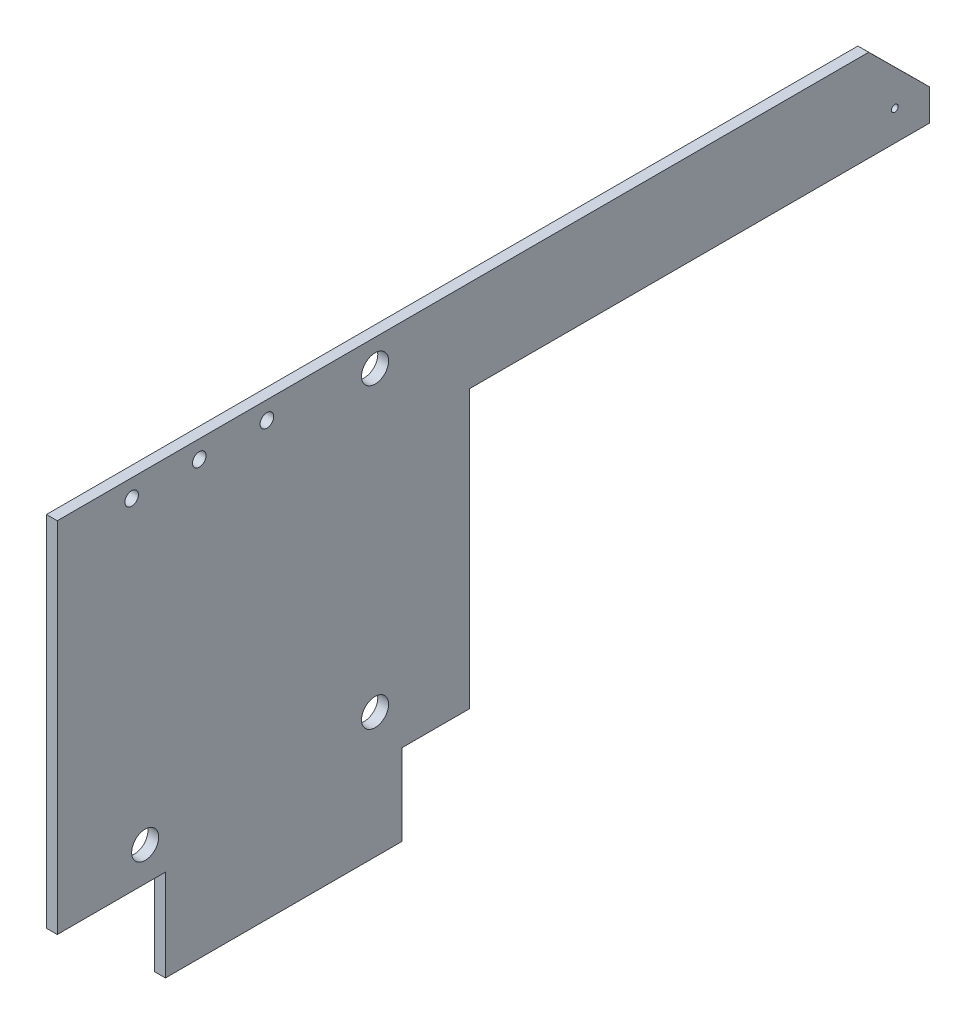
ISO-10303-21;
HEADER;
FILE_DESCRIPTION(('STEP AP214'),'2;1');
FILE_NAME('part.step','',(''),(''),'','','');
FILE_SCHEMA(('AUTOMOTIVE_DESIGN { 1 0 10303 214 1 1 1 1 }'));
ENDSEC;
DATA;
#1=APPLICATION_CONTEXT('core data for automotive mechanical design processes');
#2=APPLICATION_PROTOCOL_DEFINITION('international standard','automotive_design',2000,#1);
#3=PRODUCT_CONTEXT('',#1,'mechanical');
#4=PRODUCT('Part','Part','',(#3));
#5=PRODUCT_RELATED_PRODUCT_CATEGORY('part','',(#4));
#6=PRODUCT_DEFINITION_FORMATION('','',#4);
#7=PRODUCT_DEFINITION_CONTEXT('part definition',#1,'design');
#8=PRODUCT_DEFINITION('design','',#6,#7);
#9=PRODUCT_DEFINITION_SHAPE('','',#8);
#10=(LENGTH_UNIT() NAMED_UNIT(*) SI_UNIT(.MILLI.,.METRE.));
#11=(NAMED_UNIT(*) PLANE_ANGLE_UNIT() SI_UNIT($,.RADIAN.));
#12=(NAMED_UNIT(*) SI_UNIT($,.STERADIAN.) SOLID_ANGLE_UNIT());
#13=UNCERTAINTY_MEASURE_WITH_UNIT(LENGTH_MEASURE(1.E-05),#10,'distance_accuracy_value','');
#14=(GEOMETRIC_REPRESENTATION_CONTEXT(3) GLOBAL_UNCERTAINTY_ASSIGNED_CONTEXT((#13)) GLOBAL_UNIT_ASSIGNED_CONTEXT((#10,
#11,#12)) REPRESENTATION_CONTEXT('',''));
#15=CARTESIAN_POINT('',(0.,0.,0.));
#16=DIRECTION('',(0.,0.,1.));
#17=DIRECTION('',(1.,0.,0.));
#18=AXIS2_PLACEMENT_3D('',#15,#16,#17);
#19=CARTESIAN_POINT('',(1.6,0.,0.));
#20=DIRECTION('',(-1.,0.,0.));
#21=DIRECTION('',(0.,0.,1.));
#22=AXIS2_PLACEMENT_3D('',#19,#20,#21);
#23=PLANE('',#22);
#24=DIRECTION('',(0.,0.,-1.));
#25=VECTOR('',#24,1.);
#26=CARTESIAN_POINT('',(1.6,0.,-16.));
#27=LINE('',#26,#25);
#28=CARTESIAN_POINT('',(1.6,0.,0.));
#29=VERTEX_POINT('',#28);
#30=CARTESIAN_POINT('',(1.6,0.,-16.));
#31=VERTEX_POINT('',#30);
#32=EDGE_CURVE('E191',#29,#31,#27,.T.);
#33=ORIENTED_EDGE('',*,*,#32,.T.);
#34=DIRECTION('',(0.,-1.,0.));
#35=VECTOR('',#34,1.);
#36=CARTESIAN_POINT('',(1.6,-13.5639260212554,-16.));
#37=LINE('',#36,#35);
#38=CARTESIAN_POINT('',(1.6,-13.5639260212554,-16.));
#39=VERTEX_POINT('',#38);
#40=EDGE_CURVE('E109',#31,#39,#37,.T.);
#41=ORIENTED_EDGE('',*,*,#40,.T.);
#42=DIRECTION('',(0.,0.,-1.));
#43=VECTOR('',#42,1.);
#44=CARTESIAN_POINT('',(1.6,-13.5639260212554,-51.));
#45=LINE('',#44,#43);
#46=CARTESIAN_POINT('',(1.6,-13.5639260212554,-51.));
#47=VERTEX_POINT('',#46);
#48=EDGE_CURVE('E224',#39,#47,#45,.T.);
#49=ORIENTED_EDGE('',*,*,#48,.T.);
#50=DIRECTION('',(0.,1.,0.));
#51=VECTOR('',#50,1.);
#52=CARTESIAN_POINT('',(1.6,-1.56392602125544,-51.));
#53=LINE('',#52,#51);
#54=CARTESIAN_POINT('',(1.6,-1.56392602125544,-51.));
#55=VERTEX_POINT('',#54);
#56=EDGE_CURVE('E244',#47,#55,#53,.T.);
#57=ORIENTED_EDGE('',*,*,#56,.T.);
#58=DIRECTION('',(0.,0.,-1.));
#59=VECTOR('',#58,1.);
#60=CARTESIAN_POINT('',(1.6,-1.56392602125544,-61.));
#61=LINE('',#60,#59);
#62=CARTESIAN_POINT('',(1.6,-1.56392602125544,-61.));
#63=VERTEX_POINT('',#62);
#64=EDGE_CURVE('E240',#55,#63,#61,.T.);
#65=ORIENTED_EDGE('',*,*,#64,.T.);
#66=DIRECTION('',(0.,1.,0.));
#67=VECTOR('',#66,1.);
#68=CARTESIAN_POINT('',(1.6,39.4234303047777,-61.));
#69=LINE('',#68,#67);
#70=CARTESIAN_POINT('',(1.6,39.4234303047777,-61.));
#71=VERTEX_POINT('',#70);
#72=EDGE_CURVE('E243',#63,#71,#69,.T.);
#73=ORIENTED_EDGE('',*,*,#72,.T.);
#74=DIRECTION('',(0.,0.,-1.));
#75=VECTOR('',#74,1.);
#76=CARTESIAN_POINT('',(1.6,39.4234303047777,-129.));
#77=LINE('',#76,#75);
#78=CARTESIAN_POINT('',(1.6,39.4234303047777,-129.));
#79=VERTEX_POINT('',#78);
#80=EDGE_CURVE('E248',#71,#79,#77,.T.);
#81=ORIENTED_EDGE('',*,*,#80,.T.);
#82=DIRECTION('',(0.,1.,0.));
#83=VECTOR('',#82,1.);
#84=CARTESIAN_POINT('',(1.6,44.0634303047776,-129.));
#85=LINE('',#84,#83);
#86=CARTESIAN_POINT('',(1.6,44.0634303047776,-129.));
#87=VERTEX_POINT('',#86);
#88=EDGE_CURVE('E137',#79,#87,#85,.T.);
#89=ORIENTED_EDGE('',*,*,#88,.T.);
#90=DIRECTION('',(0.,0.704601785817616,0.709602933634456));
#91=VECTOR('',#90,1.);
#92=CARTESIAN_POINT('',(1.6,53.,-120.));
#93=LINE('',#92,#91);
#94=CARTESIAN_POINT('',(1.6,53.,-120.));
#95=VERTEX_POINT('',#94);
#96=EDGE_CURVE('E131',#87,#95,#93,.T.);
#97=ORIENTED_EDGE('',*,*,#96,.T.);
#98=DIRECTION('',(0.,0.,1.));
#99=VECTOR('',#98,1.);
#100=CARTESIAN_POINT('',(1.6,53.,0.));
#101=LINE('',#100,#99);
#102=CARTESIAN_POINT('',(1.6,53.,0.));
#103=VERTEX_POINT('',#102);
#104=EDGE_CURVE('E135',#95,#103,#101,.T.);
#105=ORIENTED_EDGE('',*,*,#104,.T.);
#106=DIRECTION('',(0.,-1.,0.));
#107=VECTOR('',#106,1.);
#108=CARTESIAN_POINT('',(1.6,0.,0.));
#109=LINE('',#108,#107);
#110=EDGE_CURVE('E57',#103,#29,#109,.T.);
#111=ORIENTED_EDGE('',*,*,#110,.T.);
#112=EDGE_LOOP('',(#33,#41,#49,#57,#65,#73,#81,#89,#97,#105,#111));
#113=FACE_BOUND('',#112,.T.);
#114=CARTESIAN_POINT('',(1.6,5.,-13.));
#115=DIRECTION('',(1.,0.,0.));
#116=DIRECTION('',(0.,0.,-1.));
#117=AXIS2_PLACEMENT_3D('',#114,#115,#116);
#118=CIRCLE('',#117,2.);
#119=CARTESIAN_POINT('',(1.6,5.,-15.));
#120=VERTEX_POINT('',#119);
#121=EDGE_CURVE('E164',#120,#120,#118,.T.);
#122=ORIENTED_EDGE('',*,*,#121,.F.);
#123=EDGE_LOOP('',(#122));
#124=FACE_BOUND('',#123,.T.);
#125=CARTESIAN_POINT('',(1.6,5.,-47.));
#126=DIRECTION('',(1.,0.,0.));
#127=DIRECTION('',(0.,0.,-1.));
#128=AXIS2_PLACEMENT_3D('',#125,#126,#127);
#129=CIRCLE('',#128,2.);
#130=CARTESIAN_POINT('',(1.6,5.,-49.));
#131=VERTEX_POINT('',#130);
#132=EDGE_CURVE('E357',#131,#131,#129,.T.);
#133=ORIENTED_EDGE('',*,*,#132,.F.);
#134=EDGE_LOOP('',(#133));
#135=FACE_BOUND('',#134,.T.);
#136=CARTESIAN_POINT('',(1.6,49.,-47.));
#137=DIRECTION('',(1.,0.,0.));
#138=DIRECTION('',(0.,0.,-1.));
#139=AXIS2_PLACEMENT_3D('',#136,#137,#138);
#140=CIRCLE('',#139,2.);
#141=CARTESIAN_POINT('',(1.6,49.,-49.));
#142=VERTEX_POINT('',#141);
#143=EDGE_CURVE('E349',#142,#142,#140,.T.);
#144=ORIENTED_EDGE('',*,*,#143,.F.);
#145=EDGE_LOOP('',(#144));
#146=FACE_BOUND('',#145,.T.);
#147=CARTESIAN_POINT('',(1.6,50.35,-21.));
#148=DIRECTION('',(1.,0.,0.));
#149=DIRECTION('',(0.,0.,-1.));
#150=AXIS2_PLACEMENT_3D('',#147,#148,#149);
#151=CIRCLE('',#150,1.00000000000001);
#152=CARTESIAN_POINT('',(1.6,50.35,-22.));
#153=VERTEX_POINT('',#152);
#154=EDGE_CURVE('E341',#153,#153,#151,.T.);
#155=ORIENTED_EDGE('',*,*,#154,.F.);
#156=EDGE_LOOP('',(#155));
#157=FACE_BOUND('',#156,.T.);
#158=CARTESIAN_POINT('',(1.6,50.35,-31.));
#159=DIRECTION('',(1.,0.,0.));
#160=DIRECTION('',(0.,0.,-1.));
#161=AXIS2_PLACEMENT_3D('',#158,#159,#160);
#162=CIRCLE('',#161,0.999999999999998);
#163=CARTESIAN_POINT('',(1.6,50.35,-32.));
#164=VERTEX_POINT('',#163);
#165=EDGE_CURVE('E333',#164,#164,#162,.T.);
#166=ORIENTED_EDGE('',*,*,#165,.F.);
#167=EDGE_LOOP('',(#166));
#168=FACE_BOUND('',#167,.T.);
#169=CARTESIAN_POINT('',(1.6,50.35,-11.));
#170=DIRECTION('',(1.,0.,0.));
#171=DIRECTION('',(0.,0.,-1.));
#172=AXIS2_PLACEMENT_3D('',#169,#170,#171);
#173=CIRCLE('',#172,1.00000000000001);
#174=CARTESIAN_POINT('',(1.6,50.35,-12.));
#175=VERTEX_POINT('',#174);
#176=EDGE_CURVE('E325',#175,#175,#173,.T.);
#177=ORIENTED_EDGE('',*,*,#176,.F.);
#178=EDGE_LOOP('',(#177));
#179=FACE_BOUND('',#178,.T.);
#180=CARTESIAN_POINT('',(1.6,43.8829008644053,-123.861808855805));
#181=DIRECTION('',(1.,0.,0.));
#182=DIRECTION('',(0.,0.,-1.));
#183=AXIS2_PLACEMENT_3D('',#180,#181,#182);
#184=CIRCLE('',#183,0.499999999999999);
#185=CARTESIAN_POINT('',(1.6,43.8829008644053,-124.361808855805));
#186=VERTEX_POINT('',#185);
#187=EDGE_CURVE('E314',#186,#186,#184,.T.);
#188=ORIENTED_EDGE('',*,*,#187,.F.);
#189=EDGE_LOOP('',(#188));
#190=FACE_BOUND('',#189,.T.);
#191=ADVANCED_FACE('F39',(#113,#124,#135,#146,#157,#168,#179,#190),#23,.F.);
#192=CARTESIAN_POINT('',(0.,0.,0.));
#193=DIRECTION('',(-1.,0.,0.));
#194=DIRECTION('',(0.,0.,1.));
#195=AXIS2_PLACEMENT_3D('',#192,#193,#194);
#196=PLANE('',#195);
#197=CARTESIAN_POINT('',(0.,50.35,-11.));
#198=DIRECTION('',(1.,0.,0.));
#199=DIRECTION('',(0.,0.,-1.));
#200=AXIS2_PLACEMENT_3D('',#197,#198,#199);
#201=CIRCLE('',#200,1.00000000000001);
#202=CARTESIAN_POINT('',(0.,50.35,-12.));
#203=VERTEX_POINT('',#202);
#204=EDGE_CURVE('E322',#203,#203,#201,.T.);
#205=ORIENTED_EDGE('',*,*,#204,.T.);
#206=EDGE_LOOP('',(#205));
#207=FACE_BOUND('',#206,.T.);
#208=CARTESIAN_POINT('',(0.,50.35,-21.));
#209=DIRECTION('',(1.,0.,0.));
#210=DIRECTION('',(0.,0.,-1.));
#211=AXIS2_PLACEMENT_3D('',#208,#209,#210);
#212=CIRCLE('',#211,1.00000000000001);
#213=CARTESIAN_POINT('',(0.,50.35,-22.));
#214=VERTEX_POINT('',#213);
#215=EDGE_CURVE('E337',#214,#214,#212,.T.);
#216=ORIENTED_EDGE('',*,*,#215,.T.);
#217=EDGE_LOOP('',(#216));
#218=FACE_BOUND('',#217,.T.);
#219=CARTESIAN_POINT('',(0.,5.,-47.));
#220=DIRECTION('',(1.,0.,0.));
#221=DIRECTION('',(0.,0.,-1.));
#222=AXIS2_PLACEMENT_3D('',#219,#220,#221);
#223=CIRCLE('',#222,2.);
#224=CARTESIAN_POINT('',(0.,5.,-49.));
#225=VERTEX_POINT('',#224);
#226=EDGE_CURVE('E353',#225,#225,#223,.T.);
#227=ORIENTED_EDGE('',*,*,#226,.T.);
#228=EDGE_LOOP('',(#227));
#229=FACE_BOUND('',#228,.T.);
#230=DIRECTION('',(0.,0.,-1.));
#231=VECTOR('',#230,1.);
#232=CARTESIAN_POINT('',(0.,0.,-16.));
#233=LINE('',#232,#231);
#234=CARTESIAN_POINT('',(0.,0.,0.));
#235=VERTEX_POINT('',#234);
#236=CARTESIAN_POINT('',(0.,0.,-16.));
#237=VERTEX_POINT('',#236);
#238=EDGE_CURVE('E159',#235,#237,#233,.T.);
#239=ORIENTED_EDGE('',*,*,#238,.F.);
#240=DIRECTION('',(0.,-1.,0.));
#241=VECTOR('',#240,1.);
#242=CARTESIAN_POINT('',(0.,0.,0.));
#243=LINE('',#242,#241);
#244=CARTESIAN_POINT('',(0.,53.,0.));
#245=VERTEX_POINT('',#244);
#246=EDGE_CURVE('E101',#245,#235,#243,.T.);
#247=ORIENTED_EDGE('',*,*,#246,.F.);
#248=DIRECTION('',(0.,0.,1.));
#249=VECTOR('',#248,1.);
#250=CARTESIAN_POINT('',(0.,53.,0.));
#251=LINE('',#250,#249);
#252=CARTESIAN_POINT('',(0.,53.,-120.));
#253=VERTEX_POINT('',#252);
#254=EDGE_CURVE('E95',#253,#245,#251,.T.);
#255=ORIENTED_EDGE('',*,*,#254,.F.);
#256=DIRECTION('',(0.,0.704601785817616,0.709602933634456));
#257=VECTOR('',#256,1.);
#258=CARTESIAN_POINT('',(0.,53.,-120.));
#259=LINE('',#258,#257);
#260=CARTESIAN_POINT('',(0.,44.0634303047776,-129.));
#261=VERTEX_POINT('',#260);
#262=EDGE_CURVE('E146',#261,#253,#259,.T.);
#263=ORIENTED_EDGE('',*,*,#262,.F.);
#264=DIRECTION('',(0.,1.,0.));
#265=VECTOR('',#264,1.);
#266=CARTESIAN_POINT('',(0.,44.0634303047776,-129.));
#267=LINE('',#266,#265);
#268=CARTESIAN_POINT('',(0.,39.4234303047777,-129.));
#269=VERTEX_POINT('',#268);
#270=EDGE_CURVE('E182',#269,#261,#267,.T.);
#271=ORIENTED_EDGE('',*,*,#270,.F.);
#272=DIRECTION('',(0.,0.,-1.));
#273=VECTOR('',#272,1.);
#274=CARTESIAN_POINT('',(0.,39.4234303047777,-129.));
#275=LINE('',#274,#273);
#276=CARTESIAN_POINT('',(0.,39.4234303047777,-61.));
#277=VERTEX_POINT('',#276);
#278=EDGE_CURVE('E179',#277,#269,#275,.T.);
#279=ORIENTED_EDGE('',*,*,#278,.F.);
#280=DIRECTION('',(0.,1.,0.));
#281=VECTOR('',#280,1.);
#282=CARTESIAN_POINT('',(0.,39.4234303047777,-61.));
#283=LINE('',#282,#281);
#284=CARTESIAN_POINT('',(0.,-1.56392602125544,-61.));
#285=VERTEX_POINT('',#284);
#286=EDGE_CURVE('E176',#285,#277,#283,.T.);
#287=ORIENTED_EDGE('',*,*,#286,.F.);
#288=DIRECTION('',(0.,0.,-1.));
#289=VECTOR('',#288,1.);
#290=CARTESIAN_POINT('',(0.,-1.56392602125544,-61.));
#291=LINE('',#290,#289);
#292=CARTESIAN_POINT('',(0.,-1.56392602125544,-51.));
#293=VERTEX_POINT('',#292);
#294=EDGE_CURVE('E173',#293,#285,#291,.T.);
#295=ORIENTED_EDGE('',*,*,#294,.F.);
#296=DIRECTION('',(0.,1.,0.));
#297=VECTOR('',#296,1.);
#298=CARTESIAN_POINT('',(0.,-1.56392602125544,-51.));
#299=LINE('',#298,#297);
#300=CARTESIAN_POINT('',(0.,-13.5639260212554,-51.));
#301=VERTEX_POINT('',#300);
#302=EDGE_CURVE('E170',#301,#293,#299,.T.);
#303=ORIENTED_EDGE('',*,*,#302,.F.);
#304=DIRECTION('',(0.,0.,-1.));
#305=VECTOR('',#304,1.);
#306=CARTESIAN_POINT('',(0.,-13.5639260212554,-51.));
#307=LINE('',#306,#305);
#308=CARTESIAN_POINT('',(0.,-13.5639260212554,-16.));
#309=VERTEX_POINT('',#308);
#310=EDGE_CURVE('E167',#309,#301,#307,.T.);
#311=ORIENTED_EDGE('',*,*,#310,.F.);
#312=DIRECTION('',(0.,-1.,0.));
#313=VECTOR('',#312,1.);
#314=CARTESIAN_POINT('',(0.,-13.5639260212554,-16.));
#315=LINE('',#314,#313);
#316=EDGE_CURVE('E163',#237,#309,#315,.T.);
#317=ORIENTED_EDGE('',*,*,#316,.F.);
#318=EDGE_LOOP('',(#239,#247,#255,#263,#271,#279,#287,#295,#303,#311,#317));
#319=FACE_BOUND('',#318,.T.);
#320=CARTESIAN_POINT('',(0.,5.,-13.));
#321=DIRECTION('',(1.,0.,0.));
#322=DIRECTION('',(0.,0.,-1.));
#323=AXIS2_PLACEMENT_3D('',#320,#321,#322);
#324=CIRCLE('',#323,2.);
#325=CARTESIAN_POINT('',(0.,5.,-15.));
#326=VERTEX_POINT('',#325);
#327=EDGE_CURVE('E361',#326,#326,#324,.T.);
#328=ORIENTED_EDGE('',*,*,#327,.T.);
#329=EDGE_LOOP('',(#328));
#330=FACE_BOUND('',#329,.T.);
#331=CARTESIAN_POINT('',(0.,49.,-47.));
#332=DIRECTION('',(1.,0.,0.));
#333=DIRECTION('',(0.,0.,-1.));
#334=AXIS2_PLACEMENT_3D('',#331,#332,#333);
#335=CIRCLE('',#334,2.);
#336=CARTESIAN_POINT('',(0.,49.,-49.));
#337=VERTEX_POINT('',#336);
#338=EDGE_CURVE('E345',#337,#337,#335,.T.);
#339=ORIENTED_EDGE('',*,*,#338,.T.);
#340=EDGE_LOOP('',(#339));
#341=FACE_BOUND('',#340,.T.);
#342=CARTESIAN_POINT('',(0.,50.35,-31.));
#343=DIRECTION('',(1.,0.,0.));
#344=DIRECTION('',(0.,0.,-1.));
#345=AXIS2_PLACEMENT_3D('',#342,#343,#344);
#346=CIRCLE('',#345,0.999999999999998);
#347=CARTESIAN_POINT('',(0.,50.35,-32.));
#348=VERTEX_POINT('',#347);
#349=EDGE_CURVE('E329',#348,#348,#346,.T.);
#350=ORIENTED_EDGE('',*,*,#349,.T.);
#351=EDGE_LOOP('',(#350));
#352=FACE_BOUND('',#351,.T.);
#353=CARTESIAN_POINT('',(0.,43.8829008644053,-123.861808855805));
#354=DIRECTION('',(1.,0.,0.));
#355=DIRECTION('',(0.,0.,-1.));
#356=AXIS2_PLACEMENT_3D('',#353,#354,#355);
#357=CIRCLE('',#356,0.499999999999999);
#358=CARTESIAN_POINT('',(0.,43.8829008644053,-124.361808855805));
#359=VERTEX_POINT('',#358);
#360=EDGE_CURVE('E317',#359,#359,#357,.T.);
#361=ORIENTED_EDGE('',*,*,#360,.T.);
#362=EDGE_LOOP('',(#361));
#363=FACE_BOUND('',#362,.T.);
#364=ADVANCED_FACE('F228',(#207,#218,#229,#319,#330,#341,#352,#363),#196,.T.);
#365=CARTESIAN_POINT('',(1.6,0.,-16.));
#366=DIRECTION('',(0.,1.,0.));
#367=DIRECTION('',(0.,0.,1.));
#368=AXIS2_PLACEMENT_3D('',#365,#366,#367);
#369=PLANE('',#368);
#370=ORIENTED_EDGE('',*,*,#238,.T.);
#371=DIRECTION('',(-1.,0.,0.));
#372=VECTOR('',#371,1.);
#373=CARTESIAN_POINT('',(1.6,0.,-16.));
#374=LINE('',#373,#372);
#375=EDGE_CURVE('E11',#31,#237,#374,.T.);
#376=ORIENTED_EDGE('',*,*,#375,.F.);
#377=ORIENTED_EDGE('',*,*,#32,.F.);
#378=DIRECTION('',(-1.,0.,0.));
#379=VECTOR('',#378,1.);
#380=CARTESIAN_POINT('',(1.6,0.,0.));
#381=LINE('',#380,#379);
#382=EDGE_CURVE('E155',#29,#235,#381,.T.);
#383=ORIENTED_EDGE('',*,*,#382,.T.);
#384=EDGE_LOOP('',(#370,#376,#377,#383));
#385=FACE_BOUND('',#384,.T.);
#386=ADVANCED_FACE('F41',(#385),#369,.F.);
#387=CARTESIAN_POINT('',(1.6,-13.5639260212554,-16.));
#388=DIRECTION('',(0.,0.,-1.));
#389=DIRECTION('',(-1.,0.,0.));
#390=AXIS2_PLACEMENT_3D('',#387,#388,#389);
#391=PLANE('',#390);
#392=ORIENTED_EDGE('',*,*,#316,.T.);
#393=DIRECTION('',(-1.,0.,0.));
#394=VECTOR('',#393,1.);
#395=CARTESIAN_POINT('',(1.6,-13.5639260212554,-16.));
#396=LINE('',#395,#394);
#397=EDGE_CURVE('E49',#39,#309,#396,.T.);
#398=ORIENTED_EDGE('',*,*,#397,.F.);
#399=ORIENTED_EDGE('',*,*,#40,.F.);
#400=ORIENTED_EDGE('',*,*,#375,.T.);
#401=EDGE_LOOP('',(#392,#398,#399,#400));
#402=FACE_BOUND('',#401,.T.);
#403=ADVANCED_FACE('F496',(#402),#391,.F.);
#404=CARTESIAN_POINT('',(1.6,-13.5639260212554,-51.));
#405=DIRECTION('',(0.,1.,0.));
#406=DIRECTION('',(0.,0.,1.));
#407=AXIS2_PLACEMENT_3D('',#404,#405,#406);
#408=PLANE('',#407);
#409=ORIENTED_EDGE('',*,*,#310,.T.);
#410=DIRECTION('',(-1.,0.,0.));
#411=VECTOR('',#410,1.);
#412=CARTESIAN_POINT('',(1.6,-13.5639260212554,-51.));
#413=LINE('',#412,#411);
#414=EDGE_CURVE('E214',#47,#301,#413,.T.);
#415=ORIENTED_EDGE('',*,*,#414,.F.);
#416=ORIENTED_EDGE('',*,*,#48,.F.);
#417=ORIENTED_EDGE('',*,*,#397,.T.);
#418=EDGE_LOOP('',(#409,#415,#416,#417));
#419=FACE_BOUND('',#418,.T.);
#420=ADVANCED_FACE('F222',(#419),#408,.F.);
#421=CARTESIAN_POINT('',(1.6,-1.56392602125544,-51.));
#422=DIRECTION('',(0.,0.,1.));
#423=DIRECTION('',(1.,0.,0.));
#424=AXIS2_PLACEMENT_3D('',#421,#422,#423);
#425=PLANE('',#424);
#426=ORIENTED_EDGE('',*,*,#302,.T.);
#427=DIRECTION('',(-1.,0.,0.));
#428=VECTOR('',#427,1.);
#429=CARTESIAN_POINT('',(1.6,-1.56392602125544,-51.));
#430=LINE('',#429,#428);
#431=EDGE_CURVE('E210',#55,#293,#430,.T.);
#432=ORIENTED_EDGE('',*,*,#431,.F.);
#433=ORIENTED_EDGE('',*,*,#56,.F.);
#434=ORIENTED_EDGE('',*,*,#414,.T.);
#435=EDGE_LOOP('',(#426,#432,#433,#434));
#436=FACE_BOUND('',#435,.T.);
#437=ADVANCED_FACE('F234',(#436),#425,.F.);
#438=CARTESIAN_POINT('',(1.6,-1.56392602125544,-61.));
#439=DIRECTION('',(0.,1.,0.));
#440=DIRECTION('',(0.,0.,1.));
#441=AXIS2_PLACEMENT_3D('',#438,#439,#440);
#442=PLANE('',#441);
#443=ORIENTED_EDGE('',*,*,#294,.T.);
#444=DIRECTION('',(-1.,0.,0.));
#445=VECTOR('',#444,1.);
#446=CARTESIAN_POINT('',(1.6,-1.56392602125544,-61.));
#447=LINE('',#446,#445);
#448=EDGE_CURVE('E206',#63,#285,#447,.T.);
#449=ORIENTED_EDGE('',*,*,#448,.F.);
#450=ORIENTED_EDGE('',*,*,#64,.F.);
#451=ORIENTED_EDGE('',*,*,#431,.T.);
#452=EDGE_LOOP('',(#443,#449,#450,#451));
#453=FACE_BOUND('',#452,.T.);
#454=ADVANCED_FACE('F238',(#453),#442,.F.);
#455=CARTESIAN_POINT('',(1.6,39.4234303047777,-61.));
#456=DIRECTION('',(0.,0.,1.));
#457=DIRECTION('',(1.,0.,0.));
#458=AXIS2_PLACEMENT_3D('',#455,#456,#457);
#459=PLANE('',#458);
#460=ORIENTED_EDGE('',*,*,#286,.T.);
#461=DIRECTION('',(-1.,0.,0.));
#462=VECTOR('',#461,1.);
#463=CARTESIAN_POINT('',(1.6,39.4234303047777,-61.));
#464=LINE('',#463,#462);
#465=EDGE_CURVE('E202',#71,#277,#464,.T.);
#466=ORIENTED_EDGE('',*,*,#465,.F.);
#467=ORIENTED_EDGE('',*,*,#72,.F.);
#468=ORIENTED_EDGE('',*,*,#448,.T.);
#469=EDGE_LOOP('',(#460,#466,#467,#468));
#470=FACE_BOUND('',#469,.T.);
#471=ADVANCED_FACE('F462',(#470),#459,.F.);
#472=CARTESIAN_POINT('',(1.6,39.4234303047777,-129.));
#473=DIRECTION('',(0.,1.,0.));
#474=DIRECTION('',(0.,0.,1.));
#475=AXIS2_PLACEMENT_3D('',#472,#473,#474);
#476=PLANE('',#475);
#477=ORIENTED_EDGE('',*,*,#278,.T.);
#478=DIRECTION('',(-1.,0.,0.));
#479=VECTOR('',#478,1.);
#480=CARTESIAN_POINT('',(1.6,39.4234303047777,-129.));
#481=LINE('',#480,#479);
#482=EDGE_CURVE('E198',#79,#269,#481,.T.);
#483=ORIENTED_EDGE('',*,*,#482,.F.);
#484=ORIENTED_EDGE('',*,*,#80,.F.);
#485=ORIENTED_EDGE('',*,*,#465,.T.);
#486=EDGE_LOOP('',(#477,#483,#484,#485));
#487=FACE_BOUND('',#486,.T.);
#488=ADVANCED_FACE('F259',(#487),#476,.F.);
#489=CARTESIAN_POINT('',(1.6,44.0634303047776,-129.));
#490=DIRECTION('',(0.,0.,1.));
#491=DIRECTION('',(1.,0.,0.));
#492=AXIS2_PLACEMENT_3D('',#489,#490,#491);
#493=PLANE('',#492);
#494=ORIENTED_EDGE('',*,*,#270,.T.);
#495=DIRECTION('',(-1.,0.,0.));
#496=VECTOR('',#495,1.);
#497=CARTESIAN_POINT('',(1.6,44.0634303047776,-129.));
#498=LINE('',#497,#496);
#499=EDGE_CURVE('E148',#87,#261,#498,.T.);
#500=ORIENTED_EDGE('',*,*,#499,.F.);
#501=ORIENTED_EDGE('',*,*,#88,.F.);
#502=ORIENTED_EDGE('',*,*,#482,.T.);
#503=EDGE_LOOP('',(#494,#500,#501,#502));
#504=FACE_BOUND('',#503,.T.);
#505=ADVANCED_FACE('F263',(#504),#493,.F.);
#506=CARTESIAN_POINT('',(1.6,53.,-120.));
#507=DIRECTION('',(0.,-0.709602933634456,0.704601785817616));
#508=DIRECTION('',(0.,-0.704601785817616,-0.709602933634456));
#509=AXIS2_PLACEMENT_3D('',#506,#507,#508);
#510=PLANE('',#509);
#511=ORIENTED_EDGE('',*,*,#262,.T.);
#512=DIRECTION('',(-1.,0.,0.));
#513=VECTOR('',#512,1.);
#514=CARTESIAN_POINT('',(1.6,53.,-120.));
#515=LINE('',#514,#513);
#516=EDGE_CURVE('E143',#95,#253,#515,.T.);
#517=ORIENTED_EDGE('',*,*,#516,.F.);
#518=ORIENTED_EDGE('',*,*,#96,.F.);
#519=ORIENTED_EDGE('',*,*,#499,.T.);
#520=EDGE_LOOP('',(#511,#517,#518,#519));
#521=FACE_BOUND('',#520,.T.);
#522=ADVANCED_FACE('F144',(#521),#510,.F.);
#523=CARTESIAN_POINT('',(1.6,53.,0.));
#524=DIRECTION('',(0.,-1.,0.));
#525=DIRECTION('',(0.,0.,-1.));
#526=AXIS2_PLACEMENT_3D('',#523,#524,#525);
#527=PLANE('',#526);
#528=ORIENTED_EDGE('',*,*,#254,.T.);
#529=DIRECTION('',(-1.,0.,0.));
#530=VECTOR('',#529,1.);
#531=CARTESIAN_POINT('',(1.6,53.,0.));
#532=LINE('',#531,#530);
#533=EDGE_CURVE('E149',#103,#245,#532,.T.);
#534=ORIENTED_EDGE('',*,*,#533,.F.);
#535=ORIENTED_EDGE('',*,*,#104,.F.);
#536=ORIENTED_EDGE('',*,*,#516,.T.);
#537=EDGE_LOOP('',(#528,#534,#535,#536));
#538=FACE_BOUND('',#537,.T.);
#539=ADVANCED_FACE('F151',(#538),#527,.F.);
#540=CARTESIAN_POINT('',(1.6,0.,0.));
#541=DIRECTION('',(0.,0.,-1.));
#542=DIRECTION('',(-1.,0.,0.));
#543=AXIS2_PLACEMENT_3D('',#540,#541,#542);
#544=PLANE('',#543);
#545=ORIENTED_EDGE('',*,*,#246,.T.);
#546=ORIENTED_EDGE('',*,*,#382,.F.);
#547=ORIENTED_EDGE('',*,*,#110,.F.);
#548=ORIENTED_EDGE('',*,*,#533,.T.);
#549=EDGE_LOOP('',(#545,#546,#547,#548));
#550=FACE_BOUND('',#549,.T.);
#551=ADVANCED_FACE('F267',(#550),#544,.F.);
#552=CARTESIAN_POINT('',(1.6,5.,-13.));
#553=DIRECTION('',(-1.,0.,0.));
#554=DIRECTION('',(0.,0.,1.));
#555=AXIS2_PLACEMENT_3D('',#552,#553,#554);
#556=CYLINDRICAL_SURFACE('',#555,2.);
#557=ORIENTED_EDGE('',*,*,#121,.T.);
#558=EDGE_LOOP('',(#557));
#559=FACE_BOUND('',#558,.T.);
#560=ORIENTED_EDGE('',*,*,#327,.F.);
#561=EDGE_LOOP('',(#560));
#562=FACE_BOUND('',#561,.T.);
#563=ADVANCED_FACE('F269',(#559,#562),#556,.F.);
#564=CARTESIAN_POINT('',(1.6,5.,-47.));
#565=DIRECTION('',(-1.,0.,0.));
#566=DIRECTION('',(0.,0.,1.));
#567=AXIS2_PLACEMENT_3D('',#564,#565,#566);
#568=CYLINDRICAL_SURFACE('',#567,2.);
#569=ORIENTED_EDGE('',*,*,#132,.T.);
#570=EDGE_LOOP('',(#569));
#571=FACE_BOUND('',#570,.T.);
#572=ORIENTED_EDGE('',*,*,#226,.F.);
#573=EDGE_LOOP('',(#572));
#574=FACE_BOUND('',#573,.T.);
#575=ADVANCED_FACE('F275',(#571,#574),#568,.F.);
#576=CARTESIAN_POINT('',(1.6,49.,-47.));
#577=DIRECTION('',(-1.,0.,0.));
#578=DIRECTION('',(0.,0.,1.));
#579=AXIS2_PLACEMENT_3D('',#576,#577,#578);
#580=CYLINDRICAL_SURFACE('',#579,2.);
#581=ORIENTED_EDGE('',*,*,#143,.T.);
#582=EDGE_LOOP('',(#581));
#583=FACE_BOUND('',#582,.T.);
#584=ORIENTED_EDGE('',*,*,#338,.F.);
#585=EDGE_LOOP('',(#584));
#586=FACE_BOUND('',#585,.T.);
#587=ADVANCED_FACE('F289',(#583,#586),#580,.F.);
#588=CARTESIAN_POINT('',(1.6,50.35,-21.));
#589=DIRECTION('',(-1.,0.,0.));
#590=DIRECTION('',(0.,0.,1.));
#591=AXIS2_PLACEMENT_3D('',#588,#589,#590);
#592=CYLINDRICAL_SURFACE('',#591,1.00000000000001);
#593=ORIENTED_EDGE('',*,*,#154,.T.);
#594=EDGE_LOOP('',(#593));
#595=FACE_BOUND('',#594,.T.);
#596=ORIENTED_EDGE('',*,*,#215,.F.);
#597=EDGE_LOOP('',(#596));
#598=FACE_BOUND('',#597,.T.);
#599=ADVANCED_FACE('F293',(#595,#598),#592,.F.);
#600=CARTESIAN_POINT('',(1.6,50.35,-31.));
#601=DIRECTION('',(-1.,0.,0.));
#602=DIRECTION('',(0.,0.,1.));
#603=AXIS2_PLACEMENT_3D('',#600,#601,#602);
#604=CYLINDRICAL_SURFACE('',#603,0.999999999999998);
#605=ORIENTED_EDGE('',*,*,#165,.T.);
#606=EDGE_LOOP('',(#605));
#607=FACE_BOUND('',#606,.T.);
#608=ORIENTED_EDGE('',*,*,#349,.F.);
#609=EDGE_LOOP('',(#608));
#610=FACE_BOUND('',#609,.T.);
#611=ADVANCED_FACE('F297',(#607,#610),#604,.F.);
#612=CARTESIAN_POINT('',(1.6,50.35,-11.));
#613=DIRECTION('',(-1.,0.,0.));
#614=DIRECTION('',(0.,0.,1.));
#615=AXIS2_PLACEMENT_3D('',#612,#613,#614);
#616=CYLINDRICAL_SURFACE('',#615,1.00000000000001);
#617=ORIENTED_EDGE('',*,*,#176,.T.);
#618=EDGE_LOOP('',(#617));
#619=FACE_BOUND('',#618,.T.);
#620=ORIENTED_EDGE('',*,*,#204,.F.);
#621=EDGE_LOOP('',(#620));
#622=FACE_BOUND('',#621,.T.);
#623=ADVANCED_FACE('F301',(#619,#622),#616,.F.);
#624=CARTESIAN_POINT('',(1.6,43.8829008644053,-123.861808855805));
#625=DIRECTION('',(-1.,0.,0.));
#626=DIRECTION('',(0.,0.,1.));
#627=AXIS2_PLACEMENT_3D('',#624,#625,#626);
#628=CYLINDRICAL_SURFACE('',#627,0.499999999999999);
#629=ORIENTED_EDGE('',*,*,#187,.T.);
#630=EDGE_LOOP('',(#629));
#631=FACE_BOUND('',#630,.T.);
#632=ORIENTED_EDGE('',*,*,#360,.F.);
#633=EDGE_LOOP('',(#632));
#634=FACE_BOUND('',#633,.T.);
#635=ADVANCED_FACE('F305',(#631,#634),#628,.F.);
#636=CLOSED_SHELL('',(#191,#364,#386,#403,#420,#437,#454,#471,#488,#505,#522,#539,#551,#563,
#575,#587,#599,#611,#623,#635));
#637=MANIFOLD_SOLID_BREP('B2',#636);
#638=ADVANCED_BREP_SHAPE_REPRESENTATION('',(#18,#637),#14);
#639=SHAPE_DEFINITION_REPRESENTATION(#9,#638);
ENDSEC;
END-ISO-10303-21;
